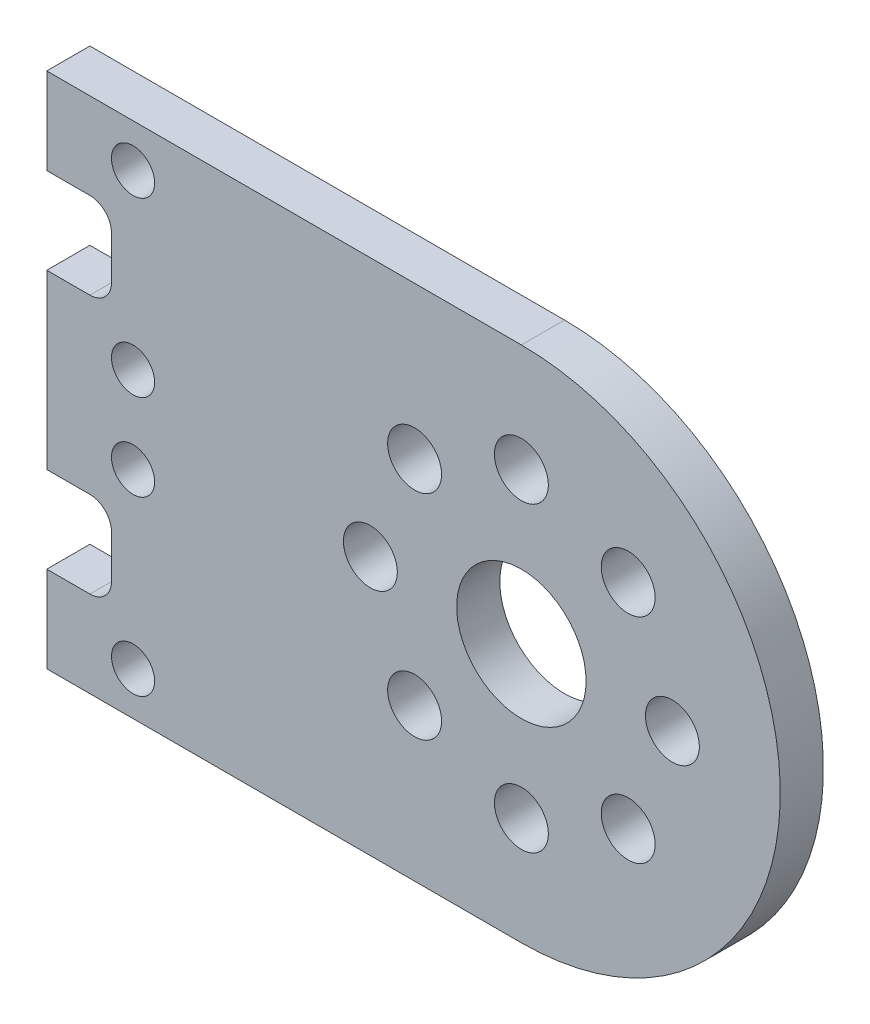
ISO-10303-21;
HEADER;
FILE_DESCRIPTION(('STEP AP214'),'2;1');
FILE_NAME('part.step','',(''),(''),'','','');
FILE_SCHEMA(('AUTOMOTIVE_DESIGN { 1 0 10303 214 1 1 1 1 }'));
ENDSEC;
DATA;
#1=APPLICATION_CONTEXT('core data for automotive mechanical design processes');
#2=APPLICATION_PROTOCOL_DEFINITION('international standard','automotive_design',2000,#1);
#3=PRODUCT_CONTEXT('',#1,'mechanical');
#4=PRODUCT('Part','Part','',(#3));
#5=PRODUCT_RELATED_PRODUCT_CATEGORY('part','',(#4));
#6=PRODUCT_DEFINITION_FORMATION('','',#4);
#7=PRODUCT_DEFINITION_CONTEXT('part definition',#1,'design');
#8=PRODUCT_DEFINITION('design','',#6,#7);
#9=PRODUCT_DEFINITION_SHAPE('','',#8);
#10=(LENGTH_UNIT() NAMED_UNIT(*) SI_UNIT(.MILLI.,.METRE.));
#11=(NAMED_UNIT(*) PLANE_ANGLE_UNIT() SI_UNIT($,.RADIAN.));
#12=(NAMED_UNIT(*) SI_UNIT($,.STERADIAN.) SOLID_ANGLE_UNIT());
#13=UNCERTAINTY_MEASURE_WITH_UNIT(LENGTH_MEASURE(1.E-05),#10,'distance_accuracy_value','');
#14=(GEOMETRIC_REPRESENTATION_CONTEXT(3) GLOBAL_UNCERTAINTY_ASSIGNED_CONTEXT((#13)) GLOBAL_UNIT_ASSIGNED_CONTEXT((#10,
#11,#12)) REPRESENTATION_CONTEXT('',''));
#15=CARTESIAN_POINT('',(0.,0.,0.));
#16=DIRECTION('',(0.,0.,1.));
#17=DIRECTION('',(1.,0.,0.));
#18=AXIS2_PLACEMENT_3D('',#15,#16,#17);
#19=CARTESIAN_POINT('',(-3.40478597967663,-0.138647311224838,2.));
#20=DIRECTION('',(0.,0.,-1.));
#21=DIRECTION('',(-1.,0.,0.));
#22=AXIS2_PLACEMENT_3D('',#19,#20,#21);
#23=PLANE('',#22);
#24=DIRECTION('',(-1.,0.,0.));
#25=VECTOR('',#24,1.);
#26=CARTESIAN_POINT('',(-25.4047859796766,11.8613526887752,2.));
#27=LINE('',#26,#25);
#28=CARTESIAN_POINT('',(-3.40478597967663,11.8613526887752,2.));
#29=VERTEX_POINT('',#28);
#30=CARTESIAN_POINT('',(-25.4047859796766,11.8613526887752,2.));
#31=VERTEX_POINT('',#30);
#32=EDGE_CURVE('E208',#29,#31,#27,.T.);
#33=ORIENTED_EDGE('',*,*,#32,.T.);
#34=DIRECTION('',(0.,-1.,0.));
#35=VECTOR('',#34,1.);
#36=CARTESIAN_POINT('',(-25.4047859796766,11.8613526887752,2.));
#37=LINE('',#36,#35);
#38=CARTESIAN_POINT('',(-25.4047859796766,7.86135268877516,2.));
#39=VERTEX_POINT('',#38);
#40=EDGE_CURVE('E116',#31,#39,#37,.T.);
#41=ORIENTED_EDGE('',*,*,#40,.T.);
#42=DIRECTION('',(1.,0.,0.));
#43=VECTOR('',#42,1.);
#44=CARTESIAN_POINT('',(-25.4047859796766,7.86135268877516,2.));
#45=LINE('',#44,#43);
#46=CARTESIAN_POINT('',(-23.4047859796766,7.86135268877516,2.));
#47=VERTEX_POINT('',#46);
#48=EDGE_CURVE('E247',#39,#47,#45,.T.);
#49=ORIENTED_EDGE('',*,*,#48,.T.);
#50=CARTESIAN_POINT('',(-23.4047859796766,6.86135268877516,2.));
#51=DIRECTION('',(0.,0.,-1.));
#52=DIRECTION('',(-1.,0.,0.));
#53=AXIS2_PLACEMENT_3D('',#50,#51,#52);
#54=CIRCLE('',#53,1.);
#55=CARTESIAN_POINT('',(-22.4047859796766,6.86135268877516,2.));
#56=VERTEX_POINT('',#55);
#57=EDGE_CURVE('E266',#47,#56,#54,.T.);
#58=ORIENTED_EDGE('',*,*,#57,.T.);
#59=DIRECTION('',(0.,-1.,0.));
#60=VECTOR('',#59,1.);
#61=CARTESIAN_POINT('',(-22.4047859796766,6.86135268877516,2.));
#62=LINE('',#61,#60);
#63=CARTESIAN_POINT('',(-22.4047859796766,4.86135268877516,2.));
#64=VERTEX_POINT('',#63);
#65=EDGE_CURVE('E263',#56,#64,#62,.T.);
#66=ORIENTED_EDGE('',*,*,#65,.T.);
#67=CARTESIAN_POINT('',(-23.4047859796766,4.86135268877516,2.));
#68=DIRECTION('',(0.,0.,-1.));
#69=DIRECTION('',(1.,0.,0.));
#70=AXIS2_PLACEMENT_3D('',#67,#68,#69);
#71=CIRCLE('',#70,1.);
#72=CARTESIAN_POINT('',(-23.4047859796766,3.86135268877516,2.));
#73=VERTEX_POINT('',#72);
#74=EDGE_CURVE('E265',#64,#73,#71,.T.);
#75=ORIENTED_EDGE('',*,*,#74,.T.);
#76=DIRECTION('',(-1.,0.,0.));
#77=VECTOR('',#76,1.);
#78=CARTESIAN_POINT('',(-23.4047859796766,3.86135268877516,2.));
#79=LINE('',#78,#77);
#80=CARTESIAN_POINT('',(-25.4047859796766,3.86135268877516,2.));
#81=VERTEX_POINT('',#80);
#82=EDGE_CURVE('E268',#73,#81,#79,.T.);
#83=ORIENTED_EDGE('',*,*,#82,.T.);
#84=DIRECTION('',(0.,-1.,0.));
#85=VECTOR('',#84,1.);
#86=CARTESIAN_POINT('',(-25.4047859796766,3.86135268877516,2.));
#87=LINE('',#86,#85);
#88=CARTESIAN_POINT('',(-25.4047859796766,-4.13864731122502,2.));
#89=VERTEX_POINT('',#88);
#90=EDGE_CURVE('E274',#81,#89,#87,.T.);
#91=ORIENTED_EDGE('',*,*,#90,.T.);
#92=DIRECTION('',(1.,0.,0.));
#93=VECTOR('',#92,1.);
#94=CARTESIAN_POINT('',(-23.4047859796766,-4.13864731122502,2.));
#95=LINE('',#94,#93);
#96=CARTESIAN_POINT('',(-23.4047859796766,-4.13864731122502,2.));
#97=VERTEX_POINT('',#96);
#98=EDGE_CURVE('E276',#89,#97,#95,.T.);
#99=ORIENTED_EDGE('',*,*,#98,.T.);
#100=CARTESIAN_POINT('',(-23.4047859796766,-5.13864731122502,2.));
#101=DIRECTION('',(0.,0.,-1.));
#102=DIRECTION('',(-1.,0.,0.));
#103=AXIS2_PLACEMENT_3D('',#100,#101,#102);
#104=CIRCLE('',#103,1.);
#105=CARTESIAN_POINT('',(-22.4047859796766,-5.13864731122502,2.));
#106=VERTEX_POINT('',#105);
#107=EDGE_CURVE('E278',#97,#106,#104,.T.);
#108=ORIENTED_EDGE('',*,*,#107,.T.);
#109=DIRECTION('',(0.,-1.,0.));
#110=VECTOR('',#109,1.);
#111=CARTESIAN_POINT('',(-22.4047859796766,-7.13864731122502,2.));
#112=LINE('',#111,#110);
#113=CARTESIAN_POINT('',(-22.4047859796766,-7.13864731122502,2.));
#114=VERTEX_POINT('',#113);
#115=EDGE_CURVE('E280',#106,#114,#112,.T.);
#116=ORIENTED_EDGE('',*,*,#115,.T.);
#117=CARTESIAN_POINT('',(-23.4047859796766,-7.13864731122502,2.));
#118=DIRECTION('',(0.,0.,-1.));
#119=DIRECTION('',(1.,0.,0.));
#120=AXIS2_PLACEMENT_3D('',#117,#118,#119);
#121=CIRCLE('',#120,1.);
#122=CARTESIAN_POINT('',(-23.4047859796766,-8.13864731122502,2.));
#123=VERTEX_POINT('',#122);
#124=EDGE_CURVE('E282',#114,#123,#121,.T.);
#125=ORIENTED_EDGE('',*,*,#124,.T.);
#126=DIRECTION('',(-1.,0.,0.));
#127=VECTOR('',#126,1.);
#128=CARTESIAN_POINT('',(-25.4047859796766,-8.13864731122502,2.));
#129=LINE('',#128,#127);
#130=CARTESIAN_POINT('',(-25.4047859796766,-8.13864731122502,2.));
#131=VERTEX_POINT('',#130);
#132=EDGE_CURVE('E159',#123,#131,#129,.T.);
#133=ORIENTED_EDGE('',*,*,#132,.T.);
#134=DIRECTION('',(0.,-1.,0.));
#135=VECTOR('',#134,1.);
#136=CARTESIAN_POINT('',(-25.4047859796766,-8.13864731122502,2.));
#137=LINE('',#136,#135);
#138=CARTESIAN_POINT('',(-25.4047859796766,-12.1386473112248,2.));
#139=VERTEX_POINT('',#138);
#140=EDGE_CURVE('E153',#131,#139,#137,.T.);
#141=ORIENTED_EDGE('',*,*,#140,.T.);
#142=DIRECTION('',(1.,0.,0.));
#143=VECTOR('',#142,1.);
#144=CARTESIAN_POINT('',(-3.40478597967662,-12.1386473112248,2.));
#145=LINE('',#144,#143);
#146=CARTESIAN_POINT('',(-3.40478597967662,-12.1386473112248,2.));
#147=VERTEX_POINT('',#146);
#148=EDGE_CURVE('E157',#139,#147,#145,.T.);
#149=ORIENTED_EDGE('',*,*,#148,.T.);
#150=CARTESIAN_POINT('',(-3.40478597967663,-0.138647311224838,2.));
#151=DIRECTION('',(0.,0.,1.));
#152=DIRECTION('',(-1.,0.,0.));
#153=AXIS2_PLACEMENT_3D('',#150,#151,#152);
#154=CIRCLE('',#153,12.);
#155=EDGE_CURVE('E49',#147,#29,#154,.T.);
#156=ORIENTED_EDGE('',*,*,#155,.T.);
#157=EDGE_LOOP('',(#33,#41,#49,#58,#66,#75,#83,#91,#99,#108,#116,#125,#133,#141,#149,#156));
#158=FACE_BOUND('',#157,.T.);
#159=CARTESIAN_POINT('',(-3.40478597967662,6.86135268877516,2.));
#160=DIRECTION('',(0.,0.,1.));
#161=DIRECTION('',(1.,0.,0.));
#162=AXIS2_PLACEMENT_3D('',#159,#160,#161);
#163=CIRCLE('',#162,1.25);
#164=CARTESIAN_POINT('',(-2.15478597967662,6.86135268877516,2.));
#165=VERTEX_POINT('',#164);
#166=EDGE_CURVE('E181',#165,#165,#163,.T.);
#167=ORIENTED_EDGE('',*,*,#166,.F.);
#168=EDGE_LOOP('',(#167));
#169=FACE_BOUND('',#168,.T.);
#170=CARTESIAN_POINT('',(1.54496148862924,4.81110015708106,2.));
#171=DIRECTION('',(0.,0.,1.));
#172=DIRECTION('',(1.,0.,0.));
#173=AXIS2_PLACEMENT_3D('',#170,#171,#172);
#174=CIRCLE('',#173,1.25);
#175=CARTESIAN_POINT('',(2.79496148862924,4.81110015708106,2.));
#176=VERTEX_POINT('',#175);
#177=EDGE_CURVE('E436',#176,#176,#174,.T.);
#178=ORIENTED_EDGE('',*,*,#177,.F.);
#179=EDGE_LOOP('',(#178));
#180=FACE_BOUND('',#179,.T.);
#181=CARTESIAN_POINT('',(-3.40478597967662,-0.13864731122484,2.));
#182=DIRECTION('',(0.,0.,1.));
#183=DIRECTION('',(1.,0.,0.));
#184=AXIS2_PLACEMENT_3D('',#181,#182,#183);
#185=CIRCLE('',#184,3.);
#186=CARTESIAN_POINT('',(-0.404785979676623,-0.13864731122484,2.));
#187=VERTEX_POINT('',#186);
#188=EDGE_CURVE('E430',#187,#187,#185,.T.);
#189=ORIENTED_EDGE('',*,*,#188,.F.);
#190=EDGE_LOOP('',(#189));
#191=FACE_BOUND('',#190,.T.);
#192=CARTESIAN_POINT('',(-21.4047859796766,9.86135268877516,2.));
#193=DIRECTION('',(0.,0.,1.));
#194=DIRECTION('',(1.,0.,0.));
#195=AXIS2_PLACEMENT_3D('',#192,#193,#194);
#196=CIRCLE('',#195,1.);
#197=CARTESIAN_POINT('',(-20.4047859796766,9.86135268877516,2.));
#198=VERTEX_POINT('',#197);
#199=EDGE_CURVE('E424',#198,#198,#196,.T.);
#200=ORIENTED_EDGE('',*,*,#199,.F.);
#201=EDGE_LOOP('',(#200));
#202=FACE_BOUND('',#201,.T.);
#203=CARTESIAN_POINT('',(3.59521402032347,-0.138647311224741,2.));
#204=DIRECTION('',(0.,0.,1.));
#205=DIRECTION('',(1.,0.,0.));
#206=AXIS2_PLACEMENT_3D('',#203,#204,#205);
#207=CIRCLE('',#206,1.25);
#208=CARTESIAN_POINT('',(4.84521402032347,-0.138647311224741,2.));
#209=VERTEX_POINT('',#208);
#210=EDGE_CURVE('E418',#209,#209,#207,.T.);
#211=ORIENTED_EDGE('',*,*,#210,.F.);
#212=EDGE_LOOP('',(#211));
#213=FACE_BOUND('',#212,.T.);
#214=CARTESIAN_POINT('',(1.54496148862937,-5.0883947795306,2.));
#215=DIRECTION('',(0.,0.,1.));
#216=DIRECTION('',(1.,0.,0.));
#217=AXIS2_PLACEMENT_3D('',#214,#215,#216);
#218=CIRCLE('',#217,1.25);
#219=CARTESIAN_POINT('',(2.79496148862937,-5.0883947795306,2.));
#220=VERTEX_POINT('',#219);
#221=EDGE_CURVE('E412',#220,#220,#218,.T.);
#222=ORIENTED_EDGE('',*,*,#221,.F.);
#223=EDGE_LOOP('',(#222));
#224=FACE_BOUND('',#223,.T.);
#225=CARTESIAN_POINT('',(-3.40478597967643,-7.13864731122484,2.));
#226=DIRECTION('',(0.,0.,1.));
#227=DIRECTION('',(1.,0.,0.));
#228=AXIS2_PLACEMENT_3D('',#225,#226,#227);
#229=CIRCLE('',#228,1.25);
#230=CARTESIAN_POINT('',(-2.15478597967643,-7.13864731122484,2.));
#231=VERTEX_POINT('',#230);
#232=EDGE_CURVE('E406',#231,#231,#229,.T.);
#233=ORIENTED_EDGE('',*,*,#232,.F.);
#234=EDGE_LOOP('',(#233));
#235=FACE_BOUND('',#234,.T.);
#236=CARTESIAN_POINT('',(-8.35453344798229,-5.08839477953074,2.));
#237=DIRECTION('',(0.,0.,1.));
#238=DIRECTION('',(1.,0.,0.));
#239=AXIS2_PLACEMENT_3D('',#236,#237,#238);
#240=CIRCLE('',#239,1.25);
#241=CARTESIAN_POINT('',(-7.10453344798229,-5.08839477953074,2.));
#242=VERTEX_POINT('',#241);
#243=EDGE_CURVE('E400',#242,#242,#240,.T.);
#244=ORIENTED_EDGE('',*,*,#243,.F.);
#245=EDGE_LOOP('',(#244));
#246=FACE_BOUND('',#245,.T.);
#247=CARTESIAN_POINT('',(-10.4047859796765,-0.138647311224932,2.));
#248=DIRECTION('',(0.,0.,1.));
#249=DIRECTION('',(1.,0.,0.));
#250=AXIS2_PLACEMENT_3D('',#247,#248,#249);
#251=CIRCLE('',#250,1.25);
#252=CARTESIAN_POINT('',(-9.15478597967652,-0.138647311224932,2.));
#253=VERTEX_POINT('',#252);
#254=EDGE_CURVE('E394',#253,#253,#251,.T.);
#255=ORIENTED_EDGE('',*,*,#254,.F.);
#256=EDGE_LOOP('',(#255));
#257=FACE_BOUND('',#256,.T.);
#258=CARTESIAN_POINT('',(-8.35453344798242,4.81110015708093,2.));
#259=DIRECTION('',(0.,0.,1.));
#260=DIRECTION('',(1.,0.,0.));
#261=AXIS2_PLACEMENT_3D('',#258,#259,#260);
#262=CIRCLE('',#261,1.25);
#263=CARTESIAN_POINT('',(-7.10453344798242,4.81110015708093,2.));
#264=VERTEX_POINT('',#263);
#265=EDGE_CURVE('E388',#264,#264,#262,.T.);
#266=ORIENTED_EDGE('',*,*,#265,.F.);
#267=EDGE_LOOP('',(#266));
#268=FACE_BOUND('',#267,.T.);
#269=CARTESIAN_POINT('',(-21.4047859796766,1.86135268877516,2.));
#270=DIRECTION('',(0.,0.,1.));
#271=DIRECTION('',(1.,0.,0.));
#272=AXIS2_PLACEMENT_3D('',#269,#270,#271);
#273=CIRCLE('',#272,1.);
#274=CARTESIAN_POINT('',(-20.4047859796766,1.86135268877516,2.));
#275=VERTEX_POINT('',#274);
#276=EDGE_CURVE('E382',#275,#275,#273,.T.);
#277=ORIENTED_EDGE('',*,*,#276,.F.);
#278=EDGE_LOOP('',(#277));
#279=FACE_BOUND('',#278,.T.);
#280=CARTESIAN_POINT('',(-21.4047859796766,-2.13864731122484,2.));
#281=DIRECTION('',(0.,0.,1.));
#282=DIRECTION('',(1.,0.,0.));
#283=AXIS2_PLACEMENT_3D('',#280,#281,#282);
#284=CIRCLE('',#283,1.);
#285=CARTESIAN_POINT('',(-20.4047859796766,-2.13864731122484,2.));
#286=VERTEX_POINT('',#285);
#287=EDGE_CURVE('E376',#286,#286,#284,.T.);
#288=ORIENTED_EDGE('',*,*,#287,.F.);
#289=EDGE_LOOP('',(#288));
#290=FACE_BOUND('',#289,.T.);
#291=CARTESIAN_POINT('',(-21.4047859796766,-10.1386473112248,2.));
#292=DIRECTION('',(0.,0.,1.));
#293=DIRECTION('',(1.,0.,0.));
#294=AXIS2_PLACEMENT_3D('',#291,#292,#293);
#295=CIRCLE('',#294,1.);
#296=CARTESIAN_POINT('',(-20.4047859796766,-10.1386473112248,2.));
#297=VERTEX_POINT('',#296);
#298=EDGE_CURVE('E367',#297,#297,#295,.T.);
#299=ORIENTED_EDGE('',*,*,#298,.F.);
#300=EDGE_LOOP('',(#299));
#301=FACE_BOUND('',#300,.T.);
#302=ADVANCED_FACE('F32',(#158,#169,#180,#191,#202,#213,#224,#235,#246,#257,#268,#279,#290,
#301),#23,.F.);
#303=CARTESIAN_POINT('',(-3.40478597967663,-0.138647311224838,0.));
#304=DIRECTION('',(0.,0.,-1.));
#305=DIRECTION('',(-1.,0.,0.));
#306=AXIS2_PLACEMENT_3D('',#303,#304,#305);
#307=PLANE('',#306);
#308=CARTESIAN_POINT('',(-21.4047859796766,-2.13864731122484,0.));
#309=DIRECTION('',(0.,0.,1.));
#310=DIRECTION('',(1.,0.,0.));
#311=AXIS2_PLACEMENT_3D('',#308,#309,#310);
#312=CIRCLE('',#311,1.);
#313=CARTESIAN_POINT('',(-20.4047859796766,-2.13864731122484,0.));
#314=VERTEX_POINT('',#313);
#315=EDGE_CURVE('E373',#314,#314,#312,.T.);
#316=ORIENTED_EDGE('',*,*,#315,.T.);
#317=EDGE_LOOP('',(#316));
#318=FACE_BOUND('',#317,.T.);
#319=CARTESIAN_POINT('',(-8.35453344798242,4.81110015708093,0.));
#320=DIRECTION('',(0.,0.,1.));
#321=DIRECTION('',(1.,0.,0.));
#322=AXIS2_PLACEMENT_3D('',#319,#320,#321);
#323=CIRCLE('',#322,1.25);
#324=CARTESIAN_POINT('',(-7.10453344798242,4.81110015708093,0.));
#325=VERTEX_POINT('',#324);
#326=EDGE_CURVE('E385',#325,#325,#323,.T.);
#327=ORIENTED_EDGE('',*,*,#326,.T.);
#328=EDGE_LOOP('',(#327));
#329=FACE_BOUND('',#328,.T.);
#330=CARTESIAN_POINT('',(-8.35453344798229,-5.08839477953074,0.));
#331=DIRECTION('',(0.,0.,1.));
#332=DIRECTION('',(1.,0.,0.));
#333=AXIS2_PLACEMENT_3D('',#330,#331,#332);
#334=CIRCLE('',#333,1.25);
#335=CARTESIAN_POINT('',(-7.10453344798229,-5.08839477953074,0.));
#336=VERTEX_POINT('',#335);
#337=EDGE_CURVE('E397',#336,#336,#334,.T.);
#338=ORIENTED_EDGE('',*,*,#337,.T.);
#339=EDGE_LOOP('',(#338));
#340=FACE_BOUND('',#339,.T.);
#341=CARTESIAN_POINT('',(1.54496148862937,-5.0883947795306,0.));
#342=DIRECTION('',(0.,0.,1.));
#343=DIRECTION('',(1.,0.,0.));
#344=AXIS2_PLACEMENT_3D('',#341,#342,#343);
#345=CIRCLE('',#344,1.25);
#346=CARTESIAN_POINT('',(2.79496148862937,-5.0883947795306,0.));
#347=VERTEX_POINT('',#346);
#348=EDGE_CURVE('E409',#347,#347,#345,.T.);
#349=ORIENTED_EDGE('',*,*,#348,.T.);
#350=EDGE_LOOP('',(#349));
#351=FACE_BOUND('',#350,.T.);
#352=CARTESIAN_POINT('',(-21.4047859796766,9.86135268877516,0.));
#353=DIRECTION('',(0.,0.,1.));
#354=DIRECTION('',(1.,0.,0.));
#355=AXIS2_PLACEMENT_3D('',#352,#353,#354);
#356=CIRCLE('',#355,1.);
#357=CARTESIAN_POINT('',(-20.4047859796766,9.86135268877516,0.));
#358=VERTEX_POINT('',#357);
#359=EDGE_CURVE('E421',#358,#358,#356,.T.);
#360=ORIENTED_EDGE('',*,*,#359,.T.);
#361=EDGE_LOOP('',(#360));
#362=FACE_BOUND('',#361,.T.);
#363=CARTESIAN_POINT('',(1.54496148862924,4.81110015708106,0.));
#364=DIRECTION('',(0.,0.,1.));
#365=DIRECTION('',(1.,0.,0.));
#366=AXIS2_PLACEMENT_3D('',#363,#364,#365);
#367=CIRCLE('',#366,1.25);
#368=CARTESIAN_POINT('',(2.79496148862924,4.81110015708106,0.));
#369=VERTEX_POINT('',#368);
#370=EDGE_CURVE('E433',#369,#369,#367,.T.);
#371=ORIENTED_EDGE('',*,*,#370,.T.);
#372=EDGE_LOOP('',(#371));
#373=FACE_BOUND('',#372,.T.);
#374=DIRECTION('',(-1.,0.,0.));
#375=VECTOR('',#374,1.);
#376=CARTESIAN_POINT('',(-25.4047859796766,11.8613526887752,0.));
#377=LINE('',#376,#375);
#378=CARTESIAN_POINT('',(-3.40478597967663,11.8613526887752,0.));
#379=VERTEX_POINT('',#378);
#380=CARTESIAN_POINT('',(-25.4047859796766,11.8613526887752,0.));
#381=VERTEX_POINT('',#380);
#382=EDGE_CURVE('E177',#379,#381,#377,.T.);
#383=ORIENTED_EDGE('',*,*,#382,.F.);
#384=CARTESIAN_POINT('',(-3.40478597967663,-0.138647311224838,0.));
#385=DIRECTION('',(0.,0.,1.));
#386=DIRECTION('',(-1.,0.,0.));
#387=AXIS2_PLACEMENT_3D('',#384,#385,#386);
#388=CIRCLE('',#387,12.);
#389=CARTESIAN_POINT('',(-3.40478597967662,-12.1386473112248,0.));
#390=VERTEX_POINT('',#389);
#391=EDGE_CURVE('E108',#390,#379,#388,.T.);
#392=ORIENTED_EDGE('',*,*,#391,.F.);
#393=DIRECTION('',(1.,0.,0.));
#394=VECTOR('',#393,1.);
#395=CARTESIAN_POINT('',(-3.40478597967662,-12.1386473112248,0.));
#396=LINE('',#395,#394);
#397=CARTESIAN_POINT('',(-25.4047859796766,-12.1386473112248,0.));
#398=VERTEX_POINT('',#397);
#399=EDGE_CURVE('E102',#398,#390,#396,.T.);
#400=ORIENTED_EDGE('',*,*,#399,.F.);
#401=DIRECTION('',(0.,-1.,0.));
#402=VECTOR('',#401,1.);
#403=CARTESIAN_POINT('',(-25.4047859796766,-8.13864731122502,0.));
#404=LINE('',#403,#402);
#405=CARTESIAN_POINT('',(-25.4047859796766,-8.13864731122502,0.));
#406=VERTEX_POINT('',#405);
#407=EDGE_CURVE('E167',#406,#398,#404,.T.);
#408=ORIENTED_EDGE('',*,*,#407,.F.);
#409=DIRECTION('',(-1.,0.,0.));
#410=VECTOR('',#409,1.);
#411=CARTESIAN_POINT('',(-25.4047859796766,-8.13864731122502,0.));
#412=LINE('',#411,#410);
#413=CARTESIAN_POINT('',(-23.4047859796766,-8.13864731122502,0.));
#414=VERTEX_POINT('',#413);
#415=EDGE_CURVE('E203',#414,#406,#412,.T.);
#416=ORIENTED_EDGE('',*,*,#415,.F.);
#417=CARTESIAN_POINT('',(-23.4047859796766,-7.13864731122502,0.));
#418=DIRECTION('',(0.,0.,-1.));
#419=DIRECTION('',(1.,0.,0.));
#420=AXIS2_PLACEMENT_3D('',#417,#418,#419);
#421=CIRCLE('',#420,1.);
#422=CARTESIAN_POINT('',(-22.4047859796766,-7.13864731122502,0.));
#423=VERTEX_POINT('',#422);
#424=EDGE_CURVE('E201',#423,#414,#421,.T.);
#425=ORIENTED_EDGE('',*,*,#424,.F.);
#426=DIRECTION('',(0.,-1.,0.));
#427=VECTOR('',#426,1.);
#428=CARTESIAN_POINT('',(-22.4047859796766,-7.13864731122502,0.));
#429=LINE('',#428,#427);
#430=CARTESIAN_POINT('',(-22.4047859796766,-5.13864731122502,0.));
#431=VERTEX_POINT('',#430);
#432=EDGE_CURVE('E199',#431,#423,#429,.T.);
#433=ORIENTED_EDGE('',*,*,#432,.F.);
#434=CARTESIAN_POINT('',(-23.4047859796766,-5.13864731122502,0.));
#435=DIRECTION('',(0.,0.,-1.));
#436=DIRECTION('',(-1.,0.,0.));
#437=AXIS2_PLACEMENT_3D('',#434,#435,#436);
#438=CIRCLE('',#437,1.);
#439=CARTESIAN_POINT('',(-23.4047859796766,-4.13864731122502,0.));
#440=VERTEX_POINT('',#439);
#441=EDGE_CURVE('E197',#440,#431,#438,.T.);
#442=ORIENTED_EDGE('',*,*,#441,.F.);
#443=DIRECTION('',(1.,0.,0.));
#444=VECTOR('',#443,1.);
#445=CARTESIAN_POINT('',(-23.4047859796766,-4.13864731122502,0.));
#446=LINE('',#445,#444);
#447=CARTESIAN_POINT('',(-25.4047859796766,-4.13864731122502,0.));
#448=VERTEX_POINT('',#447);
#449=EDGE_CURVE('E195',#448,#440,#446,.T.);
#450=ORIENTED_EDGE('',*,*,#449,.F.);
#451=DIRECTION('',(0.,-1.,0.));
#452=VECTOR('',#451,1.);
#453=CARTESIAN_POINT('',(-25.4047859796766,3.86135268877516,0.));
#454=LINE('',#453,#452);
#455=CARTESIAN_POINT('',(-25.4047859796766,3.86135268877516,0.));
#456=VERTEX_POINT('',#455);
#457=EDGE_CURVE('E193',#456,#448,#454,.T.);
#458=ORIENTED_EDGE('',*,*,#457,.F.);
#459=DIRECTION('',(-1.,0.,0.));
#460=VECTOR('',#459,1.);
#461=CARTESIAN_POINT('',(-23.4047859796766,3.86135268877516,0.));
#462=LINE('',#461,#460);
#463=CARTESIAN_POINT('',(-23.4047859796766,3.86135268877516,0.));
#464=VERTEX_POINT('',#463);
#465=EDGE_CURVE('E191',#464,#456,#462,.T.);
#466=ORIENTED_EDGE('',*,*,#465,.F.);
#467=CARTESIAN_POINT('',(-23.4047859796766,4.86135268877516,0.));
#468=DIRECTION('',(0.,0.,-1.));
#469=DIRECTION('',(1.,0.,0.));
#470=AXIS2_PLACEMENT_3D('',#467,#468,#469);
#471=CIRCLE('',#470,1.);
#472=CARTESIAN_POINT('',(-22.4047859796766,4.86135268877516,0.));
#473=VERTEX_POINT('',#472);
#474=EDGE_CURVE('E189',#473,#464,#471,.T.);
#475=ORIENTED_EDGE('',*,*,#474,.F.);
#476=DIRECTION('',(0.,-1.,0.));
#477=VECTOR('',#476,1.);
#478=CARTESIAN_POINT('',(-22.4047859796766,6.86135268877516,0.));
#479=LINE('',#478,#477);
#480=CARTESIAN_POINT('',(-22.4047859796766,6.86135268877516,0.));
#481=VERTEX_POINT('',#480);
#482=EDGE_CURVE('E187',#481,#473,#479,.T.);
#483=ORIENTED_EDGE('',*,*,#482,.F.);
#484=CARTESIAN_POINT('',(-23.4047859796766,6.86135268877516,0.));
#485=DIRECTION('',(0.,0.,-1.));
#486=DIRECTION('',(-1.,0.,0.));
#487=AXIS2_PLACEMENT_3D('',#484,#485,#486);
#488=CIRCLE('',#487,1.);
#489=CARTESIAN_POINT('',(-23.4047859796766,7.86135268877516,0.));
#490=VERTEX_POINT('',#489);
#491=EDGE_CURVE('E185',#490,#481,#488,.T.);
#492=ORIENTED_EDGE('',*,*,#491,.F.);
#493=DIRECTION('',(1.,0.,0.));
#494=VECTOR('',#493,1.);
#495=CARTESIAN_POINT('',(-25.4047859796766,7.86135268877516,0.));
#496=LINE('',#495,#494);
#497=CARTESIAN_POINT('',(-25.4047859796766,7.86135268877516,0.));
#498=VERTEX_POINT('',#497);
#499=EDGE_CURVE('E183',#498,#490,#496,.T.);
#500=ORIENTED_EDGE('',*,*,#499,.F.);
#501=DIRECTION('',(0.,-1.,0.));
#502=VECTOR('',#501,1.);
#503=CARTESIAN_POINT('',(-25.4047859796766,11.8613526887752,0.));
#504=LINE('',#503,#502);
#505=EDGE_CURVE('E180',#381,#498,#504,.T.);
#506=ORIENTED_EDGE('',*,*,#505,.F.);
#507=EDGE_LOOP('',(#383,#392,#400,#408,#416,#425,#433,#442,#450,#458,#466,#475,#483,#492,#500,#506));
#508=FACE_BOUND('',#507,.T.);
#509=CARTESIAN_POINT('',(-3.40478597967662,6.86135268877516,0.));
#510=DIRECTION('',(0.,0.,1.));
#511=DIRECTION('',(1.,0.,0.));
#512=AXIS2_PLACEMENT_3D('',#509,#510,#511);
#513=CIRCLE('',#512,1.25);
#514=CARTESIAN_POINT('',(-2.15478597967662,6.86135268877516,0.));
#515=VERTEX_POINT('',#514);
#516=EDGE_CURVE('E439',#515,#515,#513,.T.);
#517=ORIENTED_EDGE('',*,*,#516,.T.);
#518=EDGE_LOOP('',(#517));
#519=FACE_BOUND('',#518,.T.);
#520=CARTESIAN_POINT('',(-3.40478597967662,-0.13864731122484,0.));
#521=DIRECTION('',(0.,0.,1.));
#522=DIRECTION('',(1.,0.,0.));
#523=AXIS2_PLACEMENT_3D('',#520,#521,#522);
#524=CIRCLE('',#523,3.);
#525=CARTESIAN_POINT('',(-0.404785979676623,-0.13864731122484,0.));
#526=VERTEX_POINT('',#525);
#527=EDGE_CURVE('E427',#526,#526,#524,.T.);
#528=ORIENTED_EDGE('',*,*,#527,.T.);
#529=EDGE_LOOP('',(#528));
#530=FACE_BOUND('',#529,.T.);
#531=CARTESIAN_POINT('',(3.59521402032347,-0.138647311224741,0.));
#532=DIRECTION('',(0.,0.,1.));
#533=DIRECTION('',(1.,0.,0.));
#534=AXIS2_PLACEMENT_3D('',#531,#532,#533);
#535=CIRCLE('',#534,1.25);
#536=CARTESIAN_POINT('',(4.84521402032347,-0.138647311224741,0.));
#537=VERTEX_POINT('',#536);
#538=EDGE_CURVE('E415',#537,#537,#535,.T.);
#539=ORIENTED_EDGE('',*,*,#538,.T.);
#540=EDGE_LOOP('',(#539));
#541=FACE_BOUND('',#540,.T.);
#542=CARTESIAN_POINT('',(-3.40478597967643,-7.13864731122484,0.));
#543=DIRECTION('',(0.,0.,1.));
#544=DIRECTION('',(1.,0.,0.));
#545=AXIS2_PLACEMENT_3D('',#542,#543,#544);
#546=CIRCLE('',#545,1.25);
#547=CARTESIAN_POINT('',(-2.15478597967643,-7.13864731122484,0.));
#548=VERTEX_POINT('',#547);
#549=EDGE_CURVE('E403',#548,#548,#546,.T.);
#550=ORIENTED_EDGE('',*,*,#549,.T.);
#551=EDGE_LOOP('',(#550));
#552=FACE_BOUND('',#551,.T.);
#553=CARTESIAN_POINT('',(-10.4047859796765,-0.138647311224932,0.));
#554=DIRECTION('',(0.,0.,1.));
#555=DIRECTION('',(1.,0.,0.));
#556=AXIS2_PLACEMENT_3D('',#553,#554,#555);
#557=CIRCLE('',#556,1.25);
#558=CARTESIAN_POINT('',(-9.15478597967652,-0.138647311224932,0.));
#559=VERTEX_POINT('',#558);
#560=EDGE_CURVE('E391',#559,#559,#557,.T.);
#561=ORIENTED_EDGE('',*,*,#560,.T.);
#562=EDGE_LOOP('',(#561));
#563=FACE_BOUND('',#562,.T.);
#564=CARTESIAN_POINT('',(-21.4047859796766,1.86135268877516,0.));
#565=DIRECTION('',(0.,0.,1.));
#566=DIRECTION('',(1.,0.,0.));
#567=AXIS2_PLACEMENT_3D('',#564,#565,#566);
#568=CIRCLE('',#567,1.);
#569=CARTESIAN_POINT('',(-20.4047859796766,1.86135268877516,0.));
#570=VERTEX_POINT('',#569);
#571=EDGE_CURVE('E379',#570,#570,#568,.T.);
#572=ORIENTED_EDGE('',*,*,#571,.T.);
#573=EDGE_LOOP('',(#572));
#574=FACE_BOUND('',#573,.T.);
#575=CARTESIAN_POINT('',(-21.4047859796766,-10.1386473112248,0.));
#576=DIRECTION('',(0.,0.,1.));
#577=DIRECTION('',(1.,0.,0.));
#578=AXIS2_PLACEMENT_3D('',#575,#576,#577);
#579=CIRCLE('',#578,1.);
#580=CARTESIAN_POINT('',(-20.4047859796766,-10.1386473112248,0.));
#581=VERTEX_POINT('',#580);
#582=EDGE_CURVE('E370',#581,#581,#579,.T.);
#583=ORIENTED_EDGE('',*,*,#582,.T.);
#584=EDGE_LOOP('',(#583));
#585=FACE_BOUND('',#584,.T.);
#586=ADVANCED_FACE('F251',(#318,#329,#340,#351,#362,#373,#508,#519,#530,#541,#552,#563,#574,
#585),#307,.T.);
#587=CARTESIAN_POINT('',(-25.4047859796766,11.8613526887752,2.));
#588=DIRECTION('',(0.,-1.,0.));
#589=DIRECTION('',(0.,0.,-1.));
#590=AXIS2_PLACEMENT_3D('',#587,#588,#589);
#591=PLANE('',#590);
#592=ORIENTED_EDGE('',*,*,#382,.T.);
#593=DIRECTION('',(0.,0.,-1.));
#594=VECTOR('',#593,1.);
#595=CARTESIAN_POINT('',(-25.4047859796766,11.8613526887752,2.));
#596=LINE('',#595,#594);
#597=EDGE_CURVE('E11',#31,#381,#596,.T.);
#598=ORIENTED_EDGE('',*,*,#597,.F.);
#599=ORIENTED_EDGE('',*,*,#32,.F.);
#600=DIRECTION('',(0.,0.,-1.));
#601=VECTOR('',#600,1.);
#602=CARTESIAN_POINT('',(-3.40478597967663,11.8613526887752,2.));
#603=LINE('',#602,#601);
#604=EDGE_CURVE('E173',#29,#379,#603,.T.);
#605=ORIENTED_EDGE('',*,*,#604,.T.);
#606=EDGE_LOOP('',(#592,#598,#599,#605));
#607=FACE_BOUND('',#606,.T.);
#608=ADVANCED_FACE('F34',(#607),#591,.F.);
#609=CARTESIAN_POINT('',(-25.4047859796766,11.8613526887752,2.));
#610=DIRECTION('',(1.,0.,0.));
#611=DIRECTION('',(0.,0.,-1.));
#612=AXIS2_PLACEMENT_3D('',#609,#610,#611);
#613=PLANE('',#612);
#614=ORIENTED_EDGE('',*,*,#505,.T.);
#615=DIRECTION('',(0.,0.,-1.));
#616=VECTOR('',#615,1.);
#617=CARTESIAN_POINT('',(-25.4047859796766,7.86135268877516,2.));
#618=LINE('',#617,#616);
#619=EDGE_CURVE('E41',#39,#498,#618,.T.);
#620=ORIENTED_EDGE('',*,*,#619,.F.);
#621=ORIENTED_EDGE('',*,*,#40,.F.);
#622=ORIENTED_EDGE('',*,*,#597,.T.);
#623=EDGE_LOOP('',(#614,#620,#621,#622));
#624=FACE_BOUND('',#623,.T.);
#625=ADVANCED_FACE('F672',(#624),#613,.F.);
#626=CARTESIAN_POINT('',(-25.4047859796766,7.86135268877516,2.));
#627=DIRECTION('',(0.,1.,0.));
#628=DIRECTION('',(0.,0.,1.));
#629=AXIS2_PLACEMENT_3D('',#626,#627,#628);
#630=PLANE('',#629);
#631=ORIENTED_EDGE('',*,*,#499,.T.);
#632=DIRECTION('',(0.,0.,-1.));
#633=VECTOR('',#632,1.);
#634=CARTESIAN_POINT('',(-23.4047859796766,7.86135268877516,2.));
#635=LINE('',#634,#633);
#636=EDGE_CURVE('E239',#47,#490,#635,.T.);
#637=ORIENTED_EDGE('',*,*,#636,.F.);
#638=ORIENTED_EDGE('',*,*,#48,.F.);
#639=ORIENTED_EDGE('',*,*,#619,.T.);
#640=EDGE_LOOP('',(#631,#637,#638,#639));
#641=FACE_BOUND('',#640,.T.);
#642=ADVANCED_FACE('F245',(#641),#630,.F.);
#643=CARTESIAN_POINT('',(-23.4047859796766,6.86135268877516,2.));
#644=DIRECTION('',(0.,0.,-1.));
#645=DIRECTION('',(-1.,0.,0.));
#646=AXIS2_PLACEMENT_3D('',#643,#644,#645);
#647=CYLINDRICAL_SURFACE('',#646,1.);
#648=ORIENTED_EDGE('',*,*,#491,.T.);
#649=DIRECTION('',(0.,0.,-1.));
#650=VECTOR('',#649,1.);
#651=CARTESIAN_POINT('',(-22.4047859796766,6.86135268877516,2.));
#652=LINE('',#651,#650);
#653=EDGE_CURVE('E236',#56,#481,#652,.T.);
#654=ORIENTED_EDGE('',*,*,#653,.F.);
#655=ORIENTED_EDGE('',*,*,#57,.F.);
#656=ORIENTED_EDGE('',*,*,#636,.T.);
#657=EDGE_LOOP('',(#648,#654,#655,#656));
#658=FACE_BOUND('',#657,.T.);
#659=ADVANCED_FACE('F257',(#658),#647,.F.);
#660=CARTESIAN_POINT('',(-22.4047859796766,6.86135268877516,2.));
#661=DIRECTION('',(1.,0.,0.));
#662=DIRECTION('',(0.,1.,0.));
#663=AXIS2_PLACEMENT_3D('',#660,#661,#662);
#664=PLANE('',#663);
#665=ORIENTED_EDGE('',*,*,#482,.T.);
#666=DIRECTION('',(0.,0.,-1.));
#667=VECTOR('',#666,1.);
#668=CARTESIAN_POINT('',(-22.4047859796766,4.86135268877516,2.));
#669=LINE('',#668,#667);
#670=EDGE_CURVE('E233',#64,#473,#669,.T.);
#671=ORIENTED_EDGE('',*,*,#670,.F.);
#672=ORIENTED_EDGE('',*,*,#65,.F.);
#673=ORIENTED_EDGE('',*,*,#653,.T.);
#674=EDGE_LOOP('',(#665,#671,#672,#673));
#675=FACE_BOUND('',#674,.T.);
#676=ADVANCED_FACE('F261',(#675),#664,.F.);
#677=CARTESIAN_POINT('',(-23.4047859796766,4.86135268877516,2.));
#678=DIRECTION('',(0.,0.,-1.));
#679=DIRECTION('',(-1.,0.,0.));
#680=AXIS2_PLACEMENT_3D('',#677,#678,#679);
#681=CYLINDRICAL_SURFACE('',#680,1.);
#682=ORIENTED_EDGE('',*,*,#474,.T.);
#683=DIRECTION('',(0.,0.,-1.));
#684=VECTOR('',#683,1.);
#685=CARTESIAN_POINT('',(-23.4047859796766,3.86135268877516,2.));
#686=LINE('',#685,#684);
#687=EDGE_CURVE('E230',#73,#464,#686,.T.);
#688=ORIENTED_EDGE('',*,*,#687,.F.);
#689=ORIENTED_EDGE('',*,*,#74,.F.);
#690=ORIENTED_EDGE('',*,*,#670,.T.);
#691=EDGE_LOOP('',(#682,#688,#689,#690));
#692=FACE_BOUND('',#691,.T.);
#693=ADVANCED_FACE('F637',(#692),#681,.F.);
#694=CARTESIAN_POINT('',(-23.4047859796766,3.86135268877516,2.));
#695=DIRECTION('',(0.,-1.,0.));
#696=DIRECTION('',(0.,0.,-1.));
#697=AXIS2_PLACEMENT_3D('',#694,#695,#696);
#698=PLANE('',#697);
#699=ORIENTED_EDGE('',*,*,#465,.T.);
#700=DIRECTION('',(0.,0.,-1.));
#701=VECTOR('',#700,1.);
#702=CARTESIAN_POINT('',(-25.4047859796766,3.86135268877516,2.));
#703=LINE('',#702,#701);
#704=EDGE_CURVE('E227',#81,#456,#703,.T.);
#705=ORIENTED_EDGE('',*,*,#704,.F.);
#706=ORIENTED_EDGE('',*,*,#82,.F.);
#707=ORIENTED_EDGE('',*,*,#687,.T.);
#708=EDGE_LOOP('',(#699,#705,#706,#707));
#709=FACE_BOUND('',#708,.T.);
#710=ADVANCED_FACE('F627',(#709),#698,.F.);
#711=CARTESIAN_POINT('',(-25.4047859796766,3.86135268877516,2.));
#712=DIRECTION('',(1.,0.,0.));
#713=DIRECTION('',(0.,0.,-1.));
#714=AXIS2_PLACEMENT_3D('',#711,#712,#713);
#715=PLANE('',#714);
#716=ORIENTED_EDGE('',*,*,#457,.T.);
#717=DIRECTION('',(0.,0.,-1.));
#718=VECTOR('',#717,1.);
#719=CARTESIAN_POINT('',(-25.4047859796766,-4.13864731122502,2.));
#720=LINE('',#719,#718);
#721=EDGE_CURVE('E224',#89,#448,#720,.T.);
#722=ORIENTED_EDGE('',*,*,#721,.F.);
#723=ORIENTED_EDGE('',*,*,#90,.F.);
#724=ORIENTED_EDGE('',*,*,#704,.T.);
#725=EDGE_LOOP('',(#716,#722,#723,#724));
#726=FACE_BOUND('',#725,.T.);
#727=ADVANCED_FACE('F617',(#726),#715,.F.);
#728=CARTESIAN_POINT('',(-23.4047859796766,-4.13864731122502,2.));
#729=DIRECTION('',(0.,1.,0.));
#730=DIRECTION('',(0.,0.,1.));
#731=AXIS2_PLACEMENT_3D('',#728,#729,#730);
#732=PLANE('',#731);
#733=ORIENTED_EDGE('',*,*,#449,.T.);
#734=DIRECTION('',(0.,0.,-1.));
#735=VECTOR('',#734,1.);
#736=CARTESIAN_POINT('',(-23.4047859796766,-4.13864731122502,2.));
#737=LINE('',#736,#735);
#738=EDGE_CURVE('E221',#97,#440,#737,.T.);
#739=ORIENTED_EDGE('',*,*,#738,.F.);
#740=ORIENTED_EDGE('',*,*,#98,.F.);
#741=ORIENTED_EDGE('',*,*,#721,.T.);
#742=EDGE_LOOP('',(#733,#739,#740,#741));
#743=FACE_BOUND('',#742,.T.);
#744=ADVANCED_FACE('F607',(#743),#732,.F.);
#745=CARTESIAN_POINT('',(-23.4047859796766,-5.13864731122502,2.));
#746=DIRECTION('',(0.,0.,-1.));
#747=DIRECTION('',(-1.,0.,0.));
#748=AXIS2_PLACEMENT_3D('',#745,#746,#747);
#749=CYLINDRICAL_SURFACE('',#748,1.);
#750=ORIENTED_EDGE('',*,*,#441,.T.);
#751=DIRECTION('',(0.,0.,-1.));
#752=VECTOR('',#751,1.);
#753=CARTESIAN_POINT('',(-22.4047859796766,-5.13864731122502,2.));
#754=LINE('',#753,#752);
#755=EDGE_CURVE('E218',#106,#431,#754,.T.);
#756=ORIENTED_EDGE('',*,*,#755,.F.);
#757=ORIENTED_EDGE('',*,*,#107,.F.);
#758=ORIENTED_EDGE('',*,*,#738,.T.);
#759=EDGE_LOOP('',(#750,#756,#757,#758));
#760=FACE_BOUND('',#759,.T.);
#761=ADVANCED_FACE('F597',(#760),#749,.F.);
#762=CARTESIAN_POINT('',(-22.4047859796766,-7.13864731122502,2.));
#763=DIRECTION('',(1.,0.,0.));
#764=DIRECTION('',(0.,1.,0.));
#765=AXIS2_PLACEMENT_3D('',#762,#763,#764);
#766=PLANE('',#765);
#767=ORIENTED_EDGE('',*,*,#432,.T.);
#768=DIRECTION('',(0.,0.,-1.));
#769=VECTOR('',#768,1.);
#770=CARTESIAN_POINT('',(-22.4047859796766,-7.13864731122502,2.));
#771=LINE('',#770,#769);
#772=EDGE_CURVE('E215',#114,#423,#771,.T.);
#773=ORIENTED_EDGE('',*,*,#772,.F.);
#774=ORIENTED_EDGE('',*,*,#115,.F.);
#775=ORIENTED_EDGE('',*,*,#755,.T.);
#776=EDGE_LOOP('',(#767,#773,#774,#775));
#777=FACE_BOUND('',#776,.T.);
#778=ADVANCED_FACE('F588',(#777),#766,.F.);
#779=CARTESIAN_POINT('',(-23.4047859796766,-7.13864731122502,2.));
#780=DIRECTION('',(0.,0.,-1.));
#781=DIRECTION('',(-1.,0.,0.));
#782=AXIS2_PLACEMENT_3D('',#779,#780,#781);
#783=CYLINDRICAL_SURFACE('',#782,1.);
#784=ORIENTED_EDGE('',*,*,#424,.T.);
#785=DIRECTION('',(0.,0.,-1.));
#786=VECTOR('',#785,1.);
#787=CARTESIAN_POINT('',(-23.4047859796766,-8.13864731122502,2.));
#788=LINE('',#787,#786);
#789=EDGE_CURVE('E212',#123,#414,#788,.T.);
#790=ORIENTED_EDGE('',*,*,#789,.F.);
#791=ORIENTED_EDGE('',*,*,#124,.F.);
#792=ORIENTED_EDGE('',*,*,#772,.T.);
#793=EDGE_LOOP('',(#784,#790,#791,#792));
#794=FACE_BOUND('',#793,.T.);
#795=ADVANCED_FACE('F288',(#794),#783,.F.);
#796=CARTESIAN_POINT('',(-25.4047859796766,-8.13864731122502,2.));
#797=DIRECTION('',(0.,-1.,0.));
#798=DIRECTION('',(0.,0.,-1.));
#799=AXIS2_PLACEMENT_3D('',#796,#797,#798);
#800=PLANE('',#799);
#801=ORIENTED_EDGE('',*,*,#415,.T.);
#802=DIRECTION('',(0.,0.,-1.));
#803=VECTOR('',#802,1.);
#804=CARTESIAN_POINT('',(-25.4047859796766,-8.13864731122502,2.));
#805=LINE('',#804,#803);
#806=EDGE_CURVE('E168',#131,#406,#805,.T.);
#807=ORIENTED_EDGE('',*,*,#806,.F.);
#808=ORIENTED_EDGE('',*,*,#132,.F.);
#809=ORIENTED_EDGE('',*,*,#789,.T.);
#810=EDGE_LOOP('',(#801,#807,#808,#809));
#811=FACE_BOUND('',#810,.T.);
#812=ADVANCED_FACE('F292',(#811),#800,.F.);
#813=CARTESIAN_POINT('',(-25.4047859796766,-8.13864731122502,2.));
#814=DIRECTION('',(1.,0.,0.));
#815=DIRECTION('',(0.,1.,0.));
#816=AXIS2_PLACEMENT_3D('',#813,#814,#815);
#817=PLANE('',#816);
#818=ORIENTED_EDGE('',*,*,#407,.T.);
#819=DIRECTION('',(0.,0.,-1.));
#820=VECTOR('',#819,1.);
#821=CARTESIAN_POINT('',(-25.4047859796766,-12.1386473112248,2.));
#822=LINE('',#821,#820);
#823=EDGE_CURVE('E164',#139,#398,#822,.T.);
#824=ORIENTED_EDGE('',*,*,#823,.F.);
#825=ORIENTED_EDGE('',*,*,#140,.F.);
#826=ORIENTED_EDGE('',*,*,#806,.T.);
#827=EDGE_LOOP('',(#818,#824,#825,#826));
#828=FACE_BOUND('',#827,.T.);
#829=ADVANCED_FACE('F165',(#828),#817,.F.);
#830=CARTESIAN_POINT('',(-3.40478597967662,-12.1386473112248,2.));
#831=DIRECTION('',(0.,1.,0.));
#832=DIRECTION('',(-1.,0.,0.));
#833=AXIS2_PLACEMENT_3D('',#830,#831,#832);
#834=PLANE('',#833);
#835=ORIENTED_EDGE('',*,*,#399,.T.);
#836=DIRECTION('',(0.,0.,-1.));
#837=VECTOR('',#836,1.);
#838=CARTESIAN_POINT('',(-3.40478597967662,-12.1386473112248,2.));
#839=LINE('',#838,#837);
#840=EDGE_CURVE('E169',#147,#390,#839,.T.);
#841=ORIENTED_EDGE('',*,*,#840,.F.);
#842=ORIENTED_EDGE('',*,*,#148,.F.);
#843=ORIENTED_EDGE('',*,*,#823,.T.);
#844=EDGE_LOOP('',(#835,#841,#842,#843));
#845=FACE_BOUND('',#844,.T.);
#846=ADVANCED_FACE('F171',(#845),#834,.F.);
#847=CARTESIAN_POINT('',(-3.40478597967663,-0.138647311224838,2.));
#848=DIRECTION('',(0.,0.,-1.));
#849=DIRECTION('',(-1.,0.,0.));
#850=AXIS2_PLACEMENT_3D('',#847,#848,#849);
#851=CYLINDRICAL_SURFACE('',#850,12.);
#852=ORIENTED_EDGE('',*,*,#391,.T.);
#853=ORIENTED_EDGE('',*,*,#604,.F.);
#854=ORIENTED_EDGE('',*,*,#155,.F.);
#855=ORIENTED_EDGE('',*,*,#840,.T.);
#856=EDGE_LOOP('',(#852,#853,#854,#855));
#857=FACE_BOUND('',#856,.T.);
#858=ADVANCED_FACE('F296',(#857),#851,.T.);
#859=CARTESIAN_POINT('',(-3.40478597967662,6.86135268877516,2.));
#860=DIRECTION('',(0.,0.,-1.));
#861=DIRECTION('',(-1.,0.,0.));
#862=AXIS2_PLACEMENT_3D('',#859,#860,#861);
#863=CYLINDRICAL_SURFACE('',#862,1.25);
#864=ORIENTED_EDGE('',*,*,#166,.T.);
#865=EDGE_LOOP('',(#864));
#866=FACE_BOUND('',#865,.T.);
#867=ORIENTED_EDGE('',*,*,#516,.F.);
#868=EDGE_LOOP('',(#867));
#869=FACE_BOUND('',#868,.T.);
#870=ADVANCED_FACE('F298',(#866,#869),#863,.F.);
#871=CARTESIAN_POINT('',(1.54496148862924,4.81110015708106,2.));
#872=DIRECTION('',(0.,0.,-1.));
#873=DIRECTION('',(-1.,0.,0.));
#874=AXIS2_PLACEMENT_3D('',#871,#872,#873);
#875=CYLINDRICAL_SURFACE('',#874,1.25);
#876=ORIENTED_EDGE('',*,*,#177,.T.);
#877=EDGE_LOOP('',(#876));
#878=FACE_BOUND('',#877,.T.);
#879=ORIENTED_EDGE('',*,*,#370,.F.);
#880=EDGE_LOOP('',(#879));
#881=FACE_BOUND('',#880,.T.);
#882=ADVANCED_FACE('F304',(#878,#881),#875,.F.);
#883=CARTESIAN_POINT('',(-3.40478597967662,-0.13864731122484,2.));
#884=DIRECTION('',(0.,0.,-1.));
#885=DIRECTION('',(-1.,0.,0.));
#886=AXIS2_PLACEMENT_3D('',#883,#884,#885);
#887=CYLINDRICAL_SURFACE('',#886,3.);
#888=ORIENTED_EDGE('',*,*,#188,.T.);
#889=EDGE_LOOP('',(#888));
#890=FACE_BOUND('',#889,.T.);
#891=ORIENTED_EDGE('',*,*,#527,.F.);
#892=EDGE_LOOP('',(#891));
#893=FACE_BOUND('',#892,.T.);
#894=ADVANCED_FACE('F318',(#890,#893),#887,.F.);
#895=CARTESIAN_POINT('',(-21.4047859796766,9.86135268877516,2.));
#896=DIRECTION('',(0.,0.,-1.));
#897=DIRECTION('',(-1.,0.,0.));
#898=AXIS2_PLACEMENT_3D('',#895,#896,#897);
#899=CYLINDRICAL_SURFACE('',#898,1.);
#900=ORIENTED_EDGE('',*,*,#199,.T.);
#901=EDGE_LOOP('',(#900));
#902=FACE_BOUND('',#901,.T.);
#903=ORIENTED_EDGE('',*,*,#359,.F.);
#904=EDGE_LOOP('',(#903));
#905=FACE_BOUND('',#904,.T.);
#906=ADVANCED_FACE('F322',(#902,#905),#899,.F.);
#907=CARTESIAN_POINT('',(3.59521402032347,-0.138647311224741,2.));
#908=DIRECTION('',(0.,0.,-1.));
#909=DIRECTION('',(-1.,0.,0.));
#910=AXIS2_PLACEMENT_3D('',#907,#908,#909);
#911=CYLINDRICAL_SURFACE('',#910,1.25);
#912=ORIENTED_EDGE('',*,*,#210,.T.);
#913=EDGE_LOOP('',(#912));
#914=FACE_BOUND('',#913,.T.);
#915=ORIENTED_EDGE('',*,*,#538,.F.);
#916=EDGE_LOOP('',(#915));
#917=FACE_BOUND('',#916,.T.);
#918=ADVANCED_FACE('F326',(#914,#917),#911,.F.);
#919=CARTESIAN_POINT('',(1.54496148862937,-5.0883947795306,2.));
#920=DIRECTION('',(0.,0.,-1.));
#921=DIRECTION('',(-1.,0.,0.));
#922=AXIS2_PLACEMENT_3D('',#919,#920,#921);
#923=CYLINDRICAL_SURFACE('',#922,1.25);
#924=ORIENTED_EDGE('',*,*,#221,.T.);
#925=EDGE_LOOP('',(#924));
#926=FACE_BOUND('',#925,.T.);
#927=ORIENTED_EDGE('',*,*,#348,.F.);
#928=EDGE_LOOP('',(#927));
#929=FACE_BOUND('',#928,.T.);
#930=ADVANCED_FACE('F330',(#926,#929),#923,.F.);
#931=CARTESIAN_POINT('',(-3.40478597967643,-7.13864731122484,2.));
#932=DIRECTION('',(0.,0.,-1.));
#933=DIRECTION('',(-1.,0.,0.));
#934=AXIS2_PLACEMENT_3D('',#931,#932,#933);
#935=CYLINDRICAL_SURFACE('',#934,1.25);
#936=ORIENTED_EDGE('',*,*,#232,.T.);
#937=EDGE_LOOP('',(#936));
#938=FACE_BOUND('',#937,.T.);
#939=ORIENTED_EDGE('',*,*,#549,.F.);
#940=EDGE_LOOP('',(#939));
#941=FACE_BOUND('',#940,.T.);
#942=ADVANCED_FACE('F334',(#938,#941),#935,.F.);
#943=CARTESIAN_POINT('',(-8.35453344798229,-5.08839477953074,2.));
#944=DIRECTION('',(0.,0.,-1.));
#945=DIRECTION('',(-1.,0.,0.));
#946=AXIS2_PLACEMENT_3D('',#943,#944,#945);
#947=CYLINDRICAL_SURFACE('',#946,1.25);
#948=ORIENTED_EDGE('',*,*,#243,.T.);
#949=EDGE_LOOP('',(#948));
#950=FACE_BOUND('',#949,.T.);
#951=ORIENTED_EDGE('',*,*,#337,.F.);
#952=EDGE_LOOP('',(#951));
#953=FACE_BOUND('',#952,.T.);
#954=ADVANCED_FACE('F338',(#950,#953),#947,.F.);
#955=CARTESIAN_POINT('',(-10.4047859796765,-0.138647311224932,2.));
#956=DIRECTION('',(0.,0.,-1.));
#957=DIRECTION('',(-1.,0.,0.));
#958=AXIS2_PLACEMENT_3D('',#955,#956,#957);
#959=CYLINDRICAL_SURFACE('',#958,1.25);
#960=ORIENTED_EDGE('',*,*,#254,.T.);
#961=EDGE_LOOP('',(#960));
#962=FACE_BOUND('',#961,.T.);
#963=ORIENTED_EDGE('',*,*,#560,.F.);
#964=EDGE_LOOP('',(#963));
#965=FACE_BOUND('',#964,.T.);
#966=ADVANCED_FACE('F342',(#962,#965),#959,.F.);
#967=CARTESIAN_POINT('',(-8.35453344798242,4.81110015708093,2.));
#968=DIRECTION('',(0.,0.,-1.));
#969=DIRECTION('',(-1.,0.,0.));
#970=AXIS2_PLACEMENT_3D('',#967,#968,#969);
#971=CYLINDRICAL_SURFACE('',#970,1.25);
#972=ORIENTED_EDGE('',*,*,#265,.T.);
#973=EDGE_LOOP('',(#972));
#974=FACE_BOUND('',#973,.T.);
#975=ORIENTED_EDGE('',*,*,#326,.F.);
#976=EDGE_LOOP('',(#975));
#977=FACE_BOUND('',#976,.T.);
#978=ADVANCED_FACE('F346',(#974,#977),#971,.F.);
#979=CARTESIAN_POINT('',(-21.4047859796766,1.86135268877516,2.));
#980=DIRECTION('',(0.,0.,-1.));
#981=DIRECTION('',(-1.,0.,0.));
#982=AXIS2_PLACEMENT_3D('',#979,#980,#981);
#983=CYLINDRICAL_SURFACE('',#982,1.);
#984=ORIENTED_EDGE('',*,*,#276,.T.);
#985=EDGE_LOOP('',(#984));
#986=FACE_BOUND('',#985,.T.);
#987=ORIENTED_EDGE('',*,*,#571,.F.);
#988=EDGE_LOOP('',(#987));
#989=FACE_BOUND('',#988,.T.);
#990=ADVANCED_FACE('F350',(#986,#989),#983,.F.);
#991=CARTESIAN_POINT('',(-21.4047859796766,-2.13864731122484,2.));
#992=DIRECTION('',(0.,0.,-1.));
#993=DIRECTION('',(-1.,0.,0.));
#994=AXIS2_PLACEMENT_3D('',#991,#992,#993);
#995=CYLINDRICAL_SURFACE('',#994,1.);
#996=ORIENTED_EDGE('',*,*,#287,.T.);
#997=EDGE_LOOP('',(#996));
#998=FACE_BOUND('',#997,.T.);
#999=ORIENTED_EDGE('',*,*,#315,.F.);
#1000=EDGE_LOOP('',(#999));
#1001=FACE_BOUND('',#1000,.T.);
#1002=ADVANCED_FACE('F354',(#998,#1001),#995,.F.);
#1003=CARTESIAN_POINT('',(-21.4047859796766,-10.1386473112248,2.));
#1004=DIRECTION('',(0.,0.,-1.));
#1005=DIRECTION('',(-1.,0.,0.));
#1006=AXIS2_PLACEMENT_3D('',#1003,#1004,#1005);
#1007=CYLINDRICAL_SURFACE('',#1006,1.);
#1008=ORIENTED_EDGE('',*,*,#298,.T.);
#1009=EDGE_LOOP('',(#1008));
#1010=FACE_BOUND('',#1009,.T.);
#1011=ORIENTED_EDGE('',*,*,#582,.F.);
#1012=EDGE_LOOP('',(#1011));
#1013=FACE_BOUND('',#1012,.T.);
#1014=ADVANCED_FACE('F358',(#1010,#1013),#1007,.F.);
#1015=CLOSED_SHELL('',(#302,#586,#608,#625,#642,#659,#676,#693,#710,#727,#744,#761,#778,#795,
#812,#829,#846,#858,#870,#882,#894,#906,#918,#930,#942,#954,#966,#978,#990,#1002,#1014));
#1016=MANIFOLD_SOLID_BREP('B2',#1015);
#1017=ADVANCED_BREP_SHAPE_REPRESENTATION('',(#18,#1016),#14);
#1018=SHAPE_DEFINITION_REPRESENTATION(#9,#1017);
ENDSEC;
END-ISO-10303-21;
